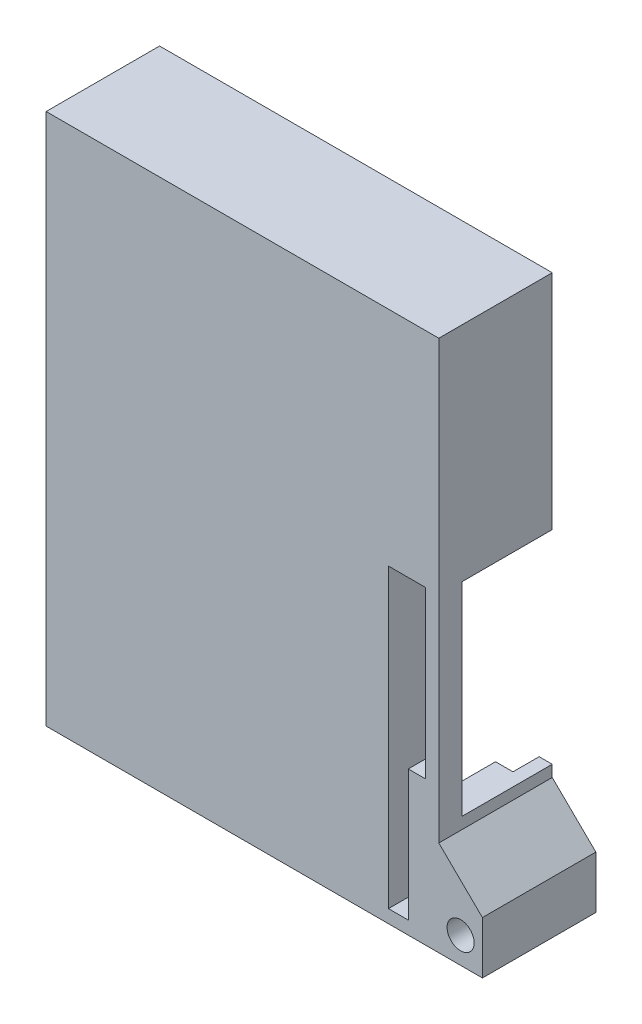
ISO-10303-21;
HEADER;
FILE_DESCRIPTION(('STEP AP214'),'2;1');
FILE_NAME('part.step','',(''),(''),'','','');
FILE_SCHEMA(('AUTOMOTIVE_DESIGN { 1 0 10303 214 1 1 1 1 }'));
ENDSEC;
DATA;
#1=APPLICATION_CONTEXT('core data for automotive mechanical design processes');
#2=APPLICATION_PROTOCOL_DEFINITION('international standard','automotive_design',2000,#1);
#3=PRODUCT_CONTEXT('',#1,'mechanical');
#4=PRODUCT('Part','Part','',(#3));
#5=PRODUCT_RELATED_PRODUCT_CATEGORY('part','',(#4));
#6=PRODUCT_DEFINITION_FORMATION('','',#4);
#7=PRODUCT_DEFINITION_CONTEXT('part definition',#1,'design');
#8=PRODUCT_DEFINITION('design','',#6,#7);
#9=PRODUCT_DEFINITION_SHAPE('','',#8);
#10=(LENGTH_UNIT() NAMED_UNIT(*) SI_UNIT(.MILLI.,.METRE.));
#11=(NAMED_UNIT(*) PLANE_ANGLE_UNIT() SI_UNIT($,.RADIAN.));
#12=(NAMED_UNIT(*) SI_UNIT($,.STERADIAN.) SOLID_ANGLE_UNIT());
#13=UNCERTAINTY_MEASURE_WITH_UNIT(LENGTH_MEASURE(1.E-05),#10,'distance_accuracy_value','');
#14=(GEOMETRIC_REPRESENTATION_CONTEXT(3) GLOBAL_UNCERTAINTY_ASSIGNED_CONTEXT((#13)) GLOBAL_UNIT_ASSIGNED_CONTEXT((#10,
#11,#12)) REPRESENTATION_CONTEXT('',''));
#15=CARTESIAN_POINT('',(0.,0.,0.));
#16=DIRECTION('',(0.,0.,1.));
#17=DIRECTION('',(1.,0.,0.));
#18=AXIS2_PLACEMENT_3D('',#15,#16,#17);
#19=CARTESIAN_POINT('',(21.,0.,-13.));
#20=DIRECTION('',(1.,0.,0.));
#21=DIRECTION('',(0.,0.,-1.));
#22=AXIS2_PLACEMENT_3D('',#19,#20,#21);
#23=PLANE('',#22);
#24=DIRECTION('',(0.,1.,0.));
#25=VECTOR('',#24,1.);
#26=CARTESIAN_POINT('',(21.,0.,-13.));
#27=LINE('',#26,#25);
#28=CARTESIAN_POINT('',(21.,5.,-13.));
#29=VERTEX_POINT('',#28);
#30=CARTESIAN_POINT('',(21.,29.,-13.));
#31=VERTEX_POINT('',#30);
#32=EDGE_CURVE('E437',#29,#31,#27,.T.);
#33=ORIENTED_EDGE('',*,*,#32,.F.);
#34=DIRECTION('',(0.,0.,1.));
#35=VECTOR('',#34,1.);
#36=CARTESIAN_POINT('',(21.,5.,-13.));
#37=LINE('',#36,#35);
#38=CARTESIAN_POINT('',(21.,5.,-10.));
#39=VERTEX_POINT('',#38);
#40=EDGE_CURVE('E469',#29,#39,#37,.T.);
#41=ORIENTED_EDGE('',*,*,#40,.T.);
#42=DIRECTION('',(0.,1.,0.));
#43=VECTOR('',#42,1.);
#44=CARTESIAN_POINT('',(21.,0.,-10.));
#45=LINE('',#44,#43);
#46=CARTESIAN_POINT('',(21.,6.00000000000001,-10.));
#47=VERTEX_POINT('',#46);
#48=EDGE_CURVE('E363',#39,#47,#45,.T.);
#49=ORIENTED_EDGE('',*,*,#48,.T.);
#50=DIRECTION('',(0.,0.,1.));
#51=VECTOR('',#50,1.);
#52=CARTESIAN_POINT('',(21.,6.00000000000001,-10.));
#53=LINE('',#52,#51);
#54=CARTESIAN_POINT('',(21.,6.00000000000001,-6.5));
#55=VERTEX_POINT('',#54);
#56=EDGE_CURVE('E390',#47,#55,#53,.T.);
#57=ORIENTED_EDGE('',*,*,#56,.T.);
#58=DIRECTION('',(0.,1.,0.));
#59=VECTOR('',#58,1.);
#60=CARTESIAN_POINT('',(21.,0.,-6.5));
#61=LINE('',#60,#59);
#62=CARTESIAN_POINT('',(21.,29.,-6.5));
#63=VERTEX_POINT('',#62);
#64=EDGE_CURVE('E404',#55,#63,#61,.T.);
#65=ORIENTED_EDGE('',*,*,#64,.T.);
#66=DIRECTION('',(0.,0.,1.));
#67=VECTOR('',#66,1.);
#68=CARTESIAN_POINT('',(21.,29.,-13.));
#69=LINE('',#68,#67);
#70=EDGE_CURVE('E318',#31,#63,#69,.T.);
#71=ORIENTED_EDGE('',*,*,#70,.F.);
#72=EDGE_LOOP('',(#33,#41,#49,#57,#65,#71));
#73=FACE_BOUND('',#72,.T.);
#74=ADVANCED_FACE('F35',(#73),#23,.F.);
#75=DIRECTION('',(0.,0.,1.));
#76=VECTOR('',#75,1.);
#77=CARTESIAN_POINT('',(21.,5.,-10.));
#78=LINE('',#77,#76);
#79=CARTESIAN_POINT('',(21.,5.,-2.64239015168766));
#80=VERTEX_POINT('',#79);
#81=CARTESIAN_POINT('',(21.,5.,0.));
#82=VERTEX_POINT('',#81);
#83=EDGE_CURVE('E393',#80,#82,#78,.T.);
#84=ORIENTED_EDGE('',*,*,#83,.F.);
#85=DIRECTION('',(0.,-1.,0.));
#86=VECTOR('',#85,1.);
#87=CARTESIAN_POINT('',(21.,0.,-2.64239015168766));
#88=LINE('',#87,#86);
#89=CARTESIAN_POINT('',(21.,-14.,-2.64239015168766));
#90=VERTEX_POINT('',#89);
#91=EDGE_CURVE('E473',#80,#90,#88,.T.);
#92=ORIENTED_EDGE('',*,*,#91,.T.);
#93=DIRECTION('',(0.,0.,1.));
#94=VECTOR('',#93,1.);
#95=CARTESIAN_POINT('',(21.,-14.,-10.));
#96=LINE('',#95,#94);
#97=CARTESIAN_POINT('',(21.,-14.,0.));
#98=VERTEX_POINT('',#97);
#99=EDGE_CURVE('E350',#90,#98,#96,.T.);
#100=ORIENTED_EDGE('',*,*,#99,.T.);
#101=DIRECTION('',(0.,1.,0.));
#102=VECTOR('',#101,1.);
#103=CARTESIAN_POINT('',(21.,0.,0.));
#104=LINE('',#103,#102);
#105=EDGE_CURVE('E277',#98,#82,#104,.T.);
#106=ORIENTED_EDGE('',*,*,#105,.T.);
#107=EDGE_LOOP('',(#84,#92,#100,#106));
#108=FACE_BOUND('',#107,.T.);
#109=ADVANCED_FACE('F523',(#108),#23,.F.);
#110=CARTESIAN_POINT('',(0.,-29.,-13.));
#111=DIRECTION('',(0.,1.,0.));
#112=DIRECTION('',(-1.,0.,0.));
#113=AXIS2_PLACEMENT_3D('',#110,#111,#112);
#114=PLANE('',#113);
#115=DIRECTION('',(-1.,0.,0.));
#116=VECTOR('',#115,1.);
#117=CARTESIAN_POINT('',(0.,-29.,-8.));
#118=LINE('',#117,#116);
#119=CARTESIAN_POINT('',(16.7304094179877,-29.,-8.));
#120=VERTEX_POINT('',#119);
#121=CARTESIAN_POINT('',(15.2304094179877,-29.,-8.));
#122=VERTEX_POINT('',#121);
#123=EDGE_CURVE('E58',#120,#122,#118,.T.);
#124=ORIENTED_EDGE('',*,*,#123,.F.);
#125=DIRECTION('',(0.,0.,1.));
#126=VECTOR('',#125,1.);
#127=CARTESIAN_POINT('',(16.7304094179877,-29.,-8.));
#128=LINE('',#127,#126);
#129=CARTESIAN_POINT('',(16.7304094179877,-29.,0.));
#130=VERTEX_POINT('',#129);
#131=EDGE_CURVE('E348',#120,#130,#128,.T.);
#132=ORIENTED_EDGE('',*,*,#131,.T.);
#133=DIRECTION('',(-1.,0.,0.));
#134=VECTOR('',#133,1.);
#135=CARTESIAN_POINT('',(0.,-29.,0.));
#136=LINE('',#135,#134);
#137=CARTESIAN_POINT('',(19.,-29.,0.));
#138=VERTEX_POINT('',#137);
#139=EDGE_CURVE('E274',#138,#130,#136,.T.);
#140=ORIENTED_EDGE('',*,*,#139,.F.);
#141=DIRECTION('',(0.,0.,1.));
#142=VECTOR('',#141,1.);
#143=CARTESIAN_POINT('',(19.,-29.,-10.));
#144=LINE('',#143,#142);
#145=CARTESIAN_POINT('',(19.,-29.,-10.));
#146=VERTEX_POINT('',#145);
#147=EDGE_CURVE('E339',#146,#138,#144,.T.);
#148=ORIENTED_EDGE('',*,*,#147,.F.);
#149=DIRECTION('',(-1.,0.,0.));
#150=VECTOR('',#149,1.);
#151=CARTESIAN_POINT('',(0.,-29.,-10.));
#152=LINE('',#151,#150);
#153=CARTESIAN_POINT('',(21.,-29.,-10.));
#154=VERTEX_POINT('',#153);
#155=EDGE_CURVE('E337',#154,#146,#152,.T.);
#156=ORIENTED_EDGE('',*,*,#155,.F.);
#157=DIRECTION('',(0.,0.,1.));
#158=VECTOR('',#157,1.);
#159=CARTESIAN_POINT('',(21.,-29.,-13.));
#160=LINE('',#159,#158);
#161=CARTESIAN_POINT('',(21.,-29.,-13.));
#162=VERTEX_POINT('',#161);
#163=EDGE_CURVE('E315',#162,#154,#160,.T.);
#164=ORIENTED_EDGE('',*,*,#163,.F.);
#165=DIRECTION('',(-1.,0.,0.));
#166=VECTOR('',#165,1.);
#167=CARTESIAN_POINT('',(0.,-29.,-13.));
#168=LINE('',#167,#166);
#169=CARTESIAN_POINT('',(-21.,-29.,-13.));
#170=VERTEX_POINT('',#169);
#171=EDGE_CURVE('E302',#162,#170,#168,.T.);
#172=ORIENTED_EDGE('',*,*,#171,.T.);
#173=DIRECTION('',(0.,0.,1.));
#174=VECTOR('',#173,1.);
#175=CARTESIAN_POINT('',(-21.,-29.,-13.));
#176=LINE('',#175,#174);
#177=CARTESIAN_POINT('',(-21.,-29.,-1.));
#178=VERTEX_POINT('',#177);
#179=EDGE_CURVE('E273',#170,#178,#176,.T.);
#180=ORIENTED_EDGE('',*,*,#179,.T.);
#181=DIRECTION('',(-1.,0.,0.));
#182=VECTOR('',#181,1.);
#183=CARTESIAN_POINT('',(0.,-29.,-1.));
#184=LINE('',#183,#182);
#185=CARTESIAN_POINT('',(4.23040941798773,-29.,-0.999999999999999));
#186=VERTEX_POINT('',#185);
#187=EDGE_CURVE('E278',#186,#178,#184,.T.);
#188=ORIENTED_EDGE('',*,*,#187,.F.);
#189=DIRECTION('',(0.,0.,1.));
#190=VECTOR('',#189,1.);
#191=CARTESIAN_POINT('',(4.23040941798773,-29.,-4.5));
#192=LINE('',#191,#190);
#193=CARTESIAN_POINT('',(4.23040941798773,-29.,-4.5));
#194=VERTEX_POINT('',#193);
#195=EDGE_CURVE('E418',#194,#186,#192,.T.);
#196=ORIENTED_EDGE('',*,*,#195,.F.);
#197=DIRECTION('',(-1.,0.,0.));
#198=VECTOR('',#197,1.);
#199=CARTESIAN_POINT('',(0.,-29.,-4.5));
#200=LINE('',#199,#198);
#201=CARTESIAN_POINT('',(15.2304094179877,-29.,-4.5));
#202=VERTEX_POINT('',#201);
#203=EDGE_CURVE('E414',#202,#194,#200,.T.);
#204=ORIENTED_EDGE('',*,*,#203,.F.);
#205=DIRECTION('',(0.,0.,1.));
#206=VECTOR('',#205,1.);
#207=CARTESIAN_POINT('',(15.2304094179877,-29.,-8.));
#208=LINE('',#207,#206);
#209=EDGE_CURVE('E486',#122,#202,#208,.T.);
#210=ORIENTED_EDGE('',*,*,#209,.F.);
#211=EDGE_LOOP('',(#124,#132,#140,#148,#156,#164,#172,#180,#188,#196,#204,#210));
#212=FACE_BOUND('',#211,.T.);
#213=ADVANCED_FACE('F37',(#212),#114,.T.);
#214=DIRECTION('',(0.,1.,0.));
#215=VECTOR('',#214,1.);
#216=CARTESIAN_POINT('',(21.,0.,-10.));
#217=LINE('',#216,#215);
#218=CARTESIAN_POINT('',(21.,-18.2844266037705,-10.));
#219=VERTEX_POINT('',#218);
#220=EDGE_CURVE('E330',#154,#219,#217,.T.);
#221=ORIENTED_EDGE('',*,*,#220,.T.);
#222=DIRECTION('',(0.,0.,-1.));
#223=VECTOR('',#222,1.);
#224=CARTESIAN_POINT('',(21.,-18.2844266037705,-13.));
#225=LINE('',#224,#223);
#226=CARTESIAN_POINT('',(21.,-18.2844266037705,-13.));
#227=VERTEX_POINT('',#226);
#228=EDGE_CURVE('E50',#219,#227,#225,.T.);
#229=ORIENTED_EDGE('',*,*,#228,.T.);
#230=EDGE_CURVE('E253',#162,#227,#27,.T.);
#231=ORIENTED_EDGE('',*,*,#230,.F.);
#232=ORIENTED_EDGE('',*,*,#163,.T.);
#233=EDGE_LOOP('',(#221,#229,#231,#232));
#234=FACE_BOUND('',#233,.T.);
#235=ADVANCED_FACE('F335',(#234),#23,.F.);
#236=CARTESIAN_POINT('',(0.,29.,-13.));
#237=DIRECTION('',(0.,1.,0.));
#238=DIRECTION('',(-1.,0.,0.));
#239=AXIS2_PLACEMENT_3D('',#236,#237,#238);
#240=PLANE('',#239);
#241=DIRECTION('',(-1.,0.,0.));
#242=VECTOR('',#241,1.);
#243=CARTESIAN_POINT('',(0.,29.,-10.));
#244=LINE('',#243,#242);
#245=CARTESIAN_POINT('',(6.69289814976103,29.,-10.));
#246=VERTEX_POINT('',#245);
#247=CARTESIAN_POINT('',(4.23040941798773,29.,-10.));
#248=VERTEX_POINT('',#247);
#249=EDGE_CURVE('E370',#246,#248,#244,.T.);
#250=ORIENTED_EDGE('',*,*,#249,.T.);
#251=DIRECTION('',(0.,0.,1.));
#252=VECTOR('',#251,1.);
#253=CARTESIAN_POINT('',(4.23040941798773,29.,-10.));
#254=LINE('',#253,#252);
#255=CARTESIAN_POINT('',(4.23040941798773,29.,-0.999999999999999));
#256=VERTEX_POINT('',#255);
#257=EDGE_CURVE('E382',#248,#256,#254,.T.);
#258=ORIENTED_EDGE('',*,*,#257,.T.);
#259=DIRECTION('',(-1.,0.,0.));
#260=VECTOR('',#259,1.);
#261=CARTESIAN_POINT('',(0.,29.,-1.));
#262=LINE('',#261,#260);
#263=CARTESIAN_POINT('',(-21.,29.,-1.));
#264=VERTEX_POINT('',#263);
#265=EDGE_CURVE('E423',#256,#264,#262,.T.);
#266=ORIENTED_EDGE('',*,*,#265,.T.);
#267=DIRECTION('',(0.,0.,1.));
#268=VECTOR('',#267,1.);
#269=CARTESIAN_POINT('',(-21.,29.,-13.));
#270=LINE('',#269,#268);
#271=CARTESIAN_POINT('',(-21.,29.,-13.));
#272=VERTEX_POINT('',#271);
#273=EDGE_CURVE('E321',#272,#264,#270,.T.);
#274=ORIENTED_EDGE('',*,*,#273,.F.);
#275=DIRECTION('',(-1.,0.,0.));
#276=VECTOR('',#275,1.);
#277=CARTESIAN_POINT('',(0.,29.,-13.));
#278=LINE('',#277,#276);
#279=EDGE_CURVE('E435',#31,#272,#278,.T.);
#280=ORIENTED_EDGE('',*,*,#279,.F.);
#281=ORIENTED_EDGE('',*,*,#70,.T.);
#282=DIRECTION('',(-1.,0.,0.));
#283=VECTOR('',#282,1.);
#284=CARTESIAN_POINT('',(0.,29.,-6.5));
#285=LINE('',#284,#283);
#286=CARTESIAN_POINT('',(6.69289814976103,29.,-6.5));
#287=VERTEX_POINT('',#286);
#288=EDGE_CURVE('E406',#63,#287,#285,.T.);
#289=ORIENTED_EDGE('',*,*,#288,.T.);
#290=DIRECTION('',(0.,0.,1.));
#291=VECTOR('',#290,1.);
#292=CARTESIAN_POINT('',(6.69289814976103,29.,-10.));
#293=LINE('',#292,#291);
#294=EDGE_CURVE('E384',#246,#287,#293,.T.);
#295=ORIENTED_EDGE('',*,*,#294,.F.);
#296=EDGE_LOOP('',(#250,#258,#266,#274,#280,#281,#289,#295));
#297=FACE_BOUND('',#296,.T.);
#298=ADVANCED_FACE('F541',(#297),#240,.F.);
#299=CARTESIAN_POINT('',(-21.,0.,-13.));
#300=DIRECTION('',(1.,0.,0.));
#301=DIRECTION('',(0.,0.,-1.));
#302=AXIS2_PLACEMENT_3D('',#299,#300,#301);
#303=PLANE('',#302);
#304=ORIENTED_EDGE('',*,*,#273,.T.);
#305=DIRECTION('',(0.,1.,0.));
#306=VECTOR('',#305,1.);
#307=CARTESIAN_POINT('',(-21.,0.,-1.));
#308=LINE('',#307,#306);
#309=EDGE_CURVE('E425',#178,#264,#308,.T.);
#310=ORIENTED_EDGE('',*,*,#309,.F.);
#311=ORIENTED_EDGE('',*,*,#179,.F.);
#312=DIRECTION('',(0.,1.,0.));
#313=VECTOR('',#312,1.);
#314=CARTESIAN_POINT('',(-21.,0.,-13.));
#315=LINE('',#314,#313);
#316=EDGE_CURVE('E432',#170,#272,#315,.T.);
#317=ORIENTED_EDGE('',*,*,#316,.T.);
#318=EDGE_LOOP('',(#304,#310,#311,#317));
#319=FACE_BOUND('',#318,.T.);
#320=ADVANCED_FACE('F544',(#319),#303,.T.);
#321=CARTESIAN_POINT('',(0.,-30.5,-13.));
#322=DIRECTION('',(0.,1.,0.));
#323=DIRECTION('',(-1.,0.,0.));
#324=AXIS2_PLACEMENT_3D('',#321,#322,#323);
#325=PLANE('',#324);
#326=DIRECTION('',(-1.,0.,0.));
#327=VECTOR('',#326,1.);
#328=CARTESIAN_POINT('',(0.,-30.5,0.));
#329=LINE('',#328,#327);
#330=CARTESIAN_POINT('',(27.5,-30.5,0.));
#331=VERTEX_POINT('',#330);
#332=CARTESIAN_POINT('',(-22.5,-30.5,0.));
#333=VERTEX_POINT('',#332);
#334=EDGE_CURVE('E281',#331,#333,#329,.T.);
#335=ORIENTED_EDGE('',*,*,#334,.T.);
#336=DIRECTION('',(0.,0.,1.));
#337=VECTOR('',#336,1.);
#338=CARTESIAN_POINT('',(-22.5,-30.5,-13.));
#339=LINE('',#338,#337);
#340=CARTESIAN_POINT('',(-22.5,-30.5,-13.));
#341=VERTEX_POINT('',#340);
#342=EDGE_CURVE('E303',#341,#333,#339,.T.);
#343=ORIENTED_EDGE('',*,*,#342,.F.);
#344=DIRECTION('',(-1.,0.,0.));
#345=VECTOR('',#344,1.);
#346=CARTESIAN_POINT('',(0.,-30.5,-13.));
#347=LINE('',#346,#345);
#348=CARTESIAN_POINT('',(27.5,-30.5,-13.));
#349=VERTEX_POINT('',#348);
#350=EDGE_CURVE('E439',#349,#341,#347,.T.);
#351=ORIENTED_EDGE('',*,*,#350,.F.);
#352=DIRECTION('',(0.,0.,1.));
#353=VECTOR('',#352,1.);
#354=CARTESIAN_POINT('',(27.5,-30.5,-13.));
#355=LINE('',#354,#353);
#356=EDGE_CURVE('E313',#349,#331,#355,.T.);
#357=ORIENTED_EDGE('',*,*,#356,.T.);
#358=EDGE_LOOP('',(#335,#343,#351,#357));
#359=FACE_BOUND('',#358,.T.);
#360=ADVANCED_FACE('F453',(#359),#325,.F.);
#361=CARTESIAN_POINT('',(-22.5,0.,-13.));
#362=DIRECTION('',(1.,0.,0.));
#363=DIRECTION('',(0.,0.,-1.));
#364=AXIS2_PLACEMENT_3D('',#361,#362,#363);
#365=PLANE('',#364);
#366=DIRECTION('',(0.,1.,0.));
#367=VECTOR('',#366,1.);
#368=CARTESIAN_POINT('',(-22.5,0.,0.));
#369=LINE('',#368,#367);
#370=CARTESIAN_POINT('',(-22.5,30.5,0.));
#371=VERTEX_POINT('',#370);
#372=EDGE_CURVE('E296',#333,#371,#369,.T.);
#373=ORIENTED_EDGE('',*,*,#372,.T.);
#374=DIRECTION('',(0.,0.,1.));
#375=VECTOR('',#374,1.);
#376=CARTESIAN_POINT('',(-22.5,30.5,-13.));
#377=LINE('',#376,#375);
#378=CARTESIAN_POINT('',(-22.5,30.5,-13.));
#379=VERTEX_POINT('',#378);
#380=EDGE_CURVE('E306',#379,#371,#377,.T.);
#381=ORIENTED_EDGE('',*,*,#380,.F.);
#382=DIRECTION('',(0.,1.,0.));
#383=VECTOR('',#382,1.);
#384=CARTESIAN_POINT('',(-22.5,0.,-13.));
#385=LINE('',#384,#383);
#386=EDGE_CURVE('E263',#341,#379,#385,.T.);
#387=ORIENTED_EDGE('',*,*,#386,.F.);
#388=ORIENTED_EDGE('',*,*,#342,.T.);
#389=EDGE_LOOP('',(#373,#381,#387,#388));
#390=FACE_BOUND('',#389,.T.);
#391=ADVANCED_FACE('F456',(#390),#365,.F.);
#392=CARTESIAN_POINT('',(0.,30.5,-13.));
#393=DIRECTION('',(0.,1.,0.));
#394=DIRECTION('',(-1.,0.,0.));
#395=AXIS2_PLACEMENT_3D('',#392,#393,#394);
#396=PLANE('',#395);
#397=DIRECTION('',(-1.,0.,0.));
#398=VECTOR('',#397,1.);
#399=CARTESIAN_POINT('',(0.,30.5,0.));
#400=LINE('',#399,#398);
#401=CARTESIAN_POINT('',(22.5,30.5,0.));
#402=VERTEX_POINT('',#401);
#403=EDGE_CURVE('E293',#402,#371,#400,.T.);
#404=ORIENTED_EDGE('',*,*,#403,.F.);
#405=DIRECTION('',(0.,0.,1.));
#406=VECTOR('',#405,1.);
#407=CARTESIAN_POINT('',(22.5,30.5,-13.));
#408=LINE('',#407,#406);
#409=CARTESIAN_POINT('',(22.5,30.5,-13.));
#410=VERTEX_POINT('',#409);
#411=EDGE_CURVE('E308',#410,#402,#408,.T.);
#412=ORIENTED_EDGE('',*,*,#411,.F.);
#413=DIRECTION('',(-1.,0.,0.));
#414=VECTOR('',#413,1.);
#415=CARTESIAN_POINT('',(0.,30.5,-13.));
#416=LINE('',#415,#414);
#417=EDGE_CURVE('E259',#410,#379,#416,.T.);
#418=ORIENTED_EDGE('',*,*,#417,.T.);
#419=ORIENTED_EDGE('',*,*,#380,.T.);
#420=EDGE_LOOP('',(#404,#412,#418,#419));
#421=FACE_BOUND('',#420,.T.);
#422=ADVANCED_FACE('F460',(#421),#396,.T.);
#423=CARTESIAN_POINT('',(22.5,0.,-13.));
#424=DIRECTION('',(1.,0.,0.));
#425=DIRECTION('',(0.,0.,-1.));
#426=AXIS2_PLACEMENT_3D('',#423,#424,#425);
#427=PLANE('',#426);
#428=DIRECTION('',(0.,0.,1.));
#429=VECTOR('',#428,1.);
#430=CARTESIAN_POINT('',(22.5,5.,-13.));
#431=LINE('',#430,#429);
#432=CARTESIAN_POINT('',(22.5,5.,-13.));
#433=VERTEX_POINT('',#432);
#434=CARTESIAN_POINT('',(22.5,5.,-2.64239015168766));
#435=VERTEX_POINT('',#434);
#436=EDGE_CURVE('E464',#433,#435,#431,.T.);
#437=ORIENTED_EDGE('',*,*,#436,.F.);
#438=DIRECTION('',(0.,1.,0.));
#439=VECTOR('',#438,1.);
#440=CARTESIAN_POINT('',(22.5,0.,-13.));
#441=LINE('',#440,#439);
#442=EDGE_CURVE('E260',#433,#410,#441,.T.);
#443=ORIENTED_EDGE('',*,*,#442,.T.);
#444=ORIENTED_EDGE('',*,*,#411,.T.);
#445=DIRECTION('',(0.,1.,0.));
#446=VECTOR('',#445,1.);
#447=CARTESIAN_POINT('',(22.5,0.,0.));
#448=LINE('',#447,#446);
#449=CARTESIAN_POINT('',(22.5,-19.6010205144336,0.));
#450=VERTEX_POINT('',#449);
#451=EDGE_CURVE('E290',#450,#402,#448,.T.);
#452=ORIENTED_EDGE('',*,*,#451,.F.);
#453=DIRECTION('',(0.,0.,1.));
#454=VECTOR('',#453,1.);
#455=CARTESIAN_POINT('',(22.5,-19.6010205144336,-13.));
#456=LINE('',#455,#454);
#457=CARTESIAN_POINT('',(22.5,-19.6010205144336,-13.));
#458=VERTEX_POINT('',#457);
#459=EDGE_CURVE('E258',#458,#450,#456,.T.);
#460=ORIENTED_EDGE('',*,*,#459,.F.);
#461=CARTESIAN_POINT('',(22.5,-18.2844266037705,-13.));
#462=VERTEX_POINT('',#461);
#463=EDGE_CURVE('E249',#458,#462,#441,.T.);
#464=ORIENTED_EDGE('',*,*,#463,.T.);
#465=DIRECTION('',(0.,0.,-1.));
#466=VECTOR('',#465,1.);
#467=CARTESIAN_POINT('',(22.5,-18.2844266037705,-13.));
#468=LINE('',#467,#466);
#469=CARTESIAN_POINT('',(22.5,-18.2844266037705,-2.64239015168766));
#470=VERTEX_POINT('',#469);
#471=EDGE_CURVE('E231',#470,#462,#468,.T.);
#472=ORIENTED_EDGE('',*,*,#471,.F.);
#473=DIRECTION('',(0.,-1.,0.));
#474=VECTOR('',#473,1.);
#475=CARTESIAN_POINT('',(22.5,0.,-2.64239015168766));
#476=LINE('',#475,#474);
#477=EDGE_CURVE('E465',#435,#470,#476,.T.);
#478=ORIENTED_EDGE('',*,*,#477,.F.);
#479=EDGE_LOOP('',(#437,#443,#444,#452,#460,#464,#472,#478));
#480=FACE_BOUND('',#479,.T.);
#481=ADVANCED_FACE('F256',(#480),#427,.T.);
#482=CARTESIAN_POINT('',(1.22193904118615,1.24713631153825,-13.));
#483=DIRECTION('',(0.699854212223765,0.714285714285714,0.));
#484=DIRECTION('',(-0.714285714285714,0.699854212223765,0.));
#485=AXIS2_PLACEMENT_3D('',#482,#483,#484);
#486=PLANE('',#485);
#487=DIRECTION('',(-0.714285714285714,0.699854212223765,0.));
#488=VECTOR('',#487,1.);
#489=CARTESIAN_POINT('',(1.22193904118615,1.24713631153825,0.));
#490=LINE('',#489,#488);
#491=CARTESIAN_POINT('',(27.5,-24.5,0.));
#492=VERTEX_POINT('',#491);
#493=EDGE_CURVE('E287',#492,#450,#490,.T.);
#494=ORIENTED_EDGE('',*,*,#493,.F.);
#495=DIRECTION('',(0.,0.,1.));
#496=VECTOR('',#495,1.);
#497=CARTESIAN_POINT('',(27.5,-24.5,-13.));
#498=LINE('',#497,#496);
#499=CARTESIAN_POINT('',(27.5,-24.5,-13.));
#500=VERTEX_POINT('',#499);
#501=EDGE_CURVE('E311',#500,#492,#498,.T.);
#502=ORIENTED_EDGE('',*,*,#501,.F.);
#503=DIRECTION('',(-0.714285714285714,0.699854212223765,0.));
#504=VECTOR('',#503,1.);
#505=CARTESIAN_POINT('',(1.22193904118615,1.24713631153825,-13.));
#506=LINE('',#505,#504);
#507=EDGE_CURVE('E265',#500,#458,#506,.T.);
#508=ORIENTED_EDGE('',*,*,#507,.T.);
#509=ORIENTED_EDGE('',*,*,#459,.T.);
#510=EDGE_LOOP('',(#494,#502,#508,#509));
#511=FACE_BOUND('',#510,.T.);
#512=ADVANCED_FACE('F447',(#511),#486,.T.);
#513=CARTESIAN_POINT('',(27.5,0.,-13.));
#514=DIRECTION('',(1.,0.,0.));
#515=DIRECTION('',(0.,0.,-1.));
#516=AXIS2_PLACEMENT_3D('',#513,#514,#515);
#517=PLANE('',#516);
#518=DIRECTION('',(0.,1.,0.));
#519=VECTOR('',#518,1.);
#520=CARTESIAN_POINT('',(27.5,0.,0.));
#521=LINE('',#520,#519);
#522=EDGE_CURVE('E284',#331,#492,#521,.T.);
#523=ORIENTED_EDGE('',*,*,#522,.F.);
#524=ORIENTED_EDGE('',*,*,#356,.F.);
#525=DIRECTION('',(0.,1.,0.));
#526=VECTOR('',#525,1.);
#527=CARTESIAN_POINT('',(27.5,0.,-13.));
#528=LINE('',#527,#526);
#529=EDGE_CURVE('E441',#349,#500,#528,.T.);
#530=ORIENTED_EDGE('',*,*,#529,.T.);
#531=ORIENTED_EDGE('',*,*,#501,.T.);
#532=EDGE_LOOP('',(#523,#524,#530,#531));
#533=FACE_BOUND('',#532,.T.);
#534=ADVANCED_FACE('F821',(#533),#517,.T.);
#535=CARTESIAN_POINT('',(25.,-27.5,-13.));
#536=DIRECTION('',(0.,0.,1.));
#537=DIRECTION('',(1.,0.,0.));
#538=AXIS2_PLACEMENT_3D('',#535,#536,#537);
#539=CYLINDRICAL_SURFACE('',#538,1.55);
#540=CARTESIAN_POINT('',(25.,-27.5,-13.));
#541=DIRECTION('',(0.,0.,1.));
#542=DIRECTION('',(1.,0.,0.));
#543=AXIS2_PLACEMENT_3D('',#540,#541,#542);
#544=CIRCLE('',#543,1.55);
#545=CARTESIAN_POINT('',(26.55,-27.5,-13.));
#546=VERTEX_POINT('',#545);
#547=EDGE_CURVE('E270',#546,#546,#544,.T.);
#548=CARTESIAN_POINT('',(25.,-27.5,0.));
#549=DIRECTION('',(0.,0.,1.));
#550=DIRECTION('',(1.,0.,0.));
#551=AXIS2_PLACEMENT_3D('',#548,#549,#550);
#552=CIRCLE('',#551,1.55);
#553=CARTESIAN_POINT('',(26.55,-27.5,0.));
#554=VERTEX_POINT('',#553);
#555=EDGE_CURVE('E299',#554,#554,#552,.T.);
#556=CARTESIAN_POINT('',(26.55,-27.5,-13.));
#557=CARTESIAN_POINT('',(26.55,-27.5,-12.8645833333333));
#558=CARTESIAN_POINT('',(26.55,-27.5,-12.7291666666667));
#559=CARTESIAN_POINT('',(26.55,-27.5,-12.4583333333333));
#560=CARTESIAN_POINT('',(26.55,-27.5,-12.3229166666667));
#561=CARTESIAN_POINT('',(26.55,-27.5,-12.0520833333333));
#562=CARTESIAN_POINT('',(26.55,-27.5,-11.9166666666667));
#563=CARTESIAN_POINT('',(26.55,-27.5,-11.6458333333333));
#564=CARTESIAN_POINT('',(26.55,-27.5,-11.5104166666667));
#565=CARTESIAN_POINT('',(26.55,-27.5,-11.2395833333333));
#566=CARTESIAN_POINT('',(26.55,-27.5,-11.1041666666667));
#567=CARTESIAN_POINT('',(26.55,-27.5,-10.8333333333333));
#568=CARTESIAN_POINT('',(26.55,-27.5,-10.6979166666667));
#569=CARTESIAN_POINT('',(26.55,-27.5,-10.4270833333333));
#570=CARTESIAN_POINT('',(26.55,-27.5,-10.2916666666667));
#571=CARTESIAN_POINT('',(26.55,-27.5,-10.0208333333333));
#572=CARTESIAN_POINT('',(26.55,-27.5,-9.88541666666667));
#573=CARTESIAN_POINT('',(26.55,-27.5,-9.61458333333333));
#574=CARTESIAN_POINT('',(26.55,-27.5,-9.47916666666667));
#575=CARTESIAN_POINT('',(26.55,-27.5,-9.20833333333333));
#576=CARTESIAN_POINT('',(26.55,-27.5,-9.07291666666667));
#577=CARTESIAN_POINT('',(26.55,-27.5,-8.80208333333333));
#578=CARTESIAN_POINT('',(26.55,-27.5,-8.66666666666667));
#579=CARTESIAN_POINT('',(26.55,-27.5,-8.39583333333333));
#580=CARTESIAN_POINT('',(26.55,-27.5,-8.26041666666667));
#581=CARTESIAN_POINT('',(26.55,-27.5,-7.98958333333333));
#582=CARTESIAN_POINT('',(26.55,-27.5,-7.85416666666667));
#583=CARTESIAN_POINT('',(26.55,-27.5,-7.58333333333333));
#584=CARTESIAN_POINT('',(26.55,-27.5,-7.44791666666667));
#585=CARTESIAN_POINT('',(26.55,-27.5,-7.17708333333333));
#586=CARTESIAN_POINT('',(26.55,-27.5,-7.04166666666667));
#587=CARTESIAN_POINT('',(26.55,-27.5,-6.77083333333333));
#588=CARTESIAN_POINT('',(26.55,-27.5,-6.63541666666667));
#589=CARTESIAN_POINT('',(26.55,-27.5,-6.36458333333333));
#590=CARTESIAN_POINT('',(26.55,-27.5,-6.22916666666667));
#591=CARTESIAN_POINT('',(26.55,-27.5,-5.95833333333333));
#592=CARTESIAN_POINT('',(26.55,-27.5,-5.82291666666667));
#593=CARTESIAN_POINT('',(26.55,-27.5,-5.55208333333333));
#594=CARTESIAN_POINT('',(26.55,-27.5,-5.41666666666667));
#595=CARTESIAN_POINT('',(26.55,-27.5,-5.14583333333333));
#596=CARTESIAN_POINT('',(26.55,-27.5,-5.01041666666667));
#597=CARTESIAN_POINT('',(26.55,-27.5,-4.73958333333333));
#598=CARTESIAN_POINT('',(26.55,-27.5,-4.60416666666667));
#599=CARTESIAN_POINT('',(26.55,-27.5,-4.33333333333333));
#600=CARTESIAN_POINT('',(26.55,-27.5,-4.19791666666667));
#601=CARTESIAN_POINT('',(26.55,-27.5,-3.92708333333333));
#602=CARTESIAN_POINT('',(26.55,-27.5,-3.79166666666667));
#603=CARTESIAN_POINT('',(26.55,-27.5,-3.52083333333333));
#604=CARTESIAN_POINT('',(26.55,-27.5,-3.38541666666667));
#605=CARTESIAN_POINT('',(26.55,-27.5,-3.11458333333333));
#606=CARTESIAN_POINT('',(26.55,-27.5,-2.97916666666667));
#607=CARTESIAN_POINT('',(26.55,-27.5,-2.70833333333333));
#608=CARTESIAN_POINT('',(26.55,-27.5,-2.57291666666667));
#609=CARTESIAN_POINT('',(26.55,-27.5,-2.30208333333333));
#610=CARTESIAN_POINT('',(26.55,-27.5,-2.16666666666667));
#611=CARTESIAN_POINT('',(26.55,-27.5,-1.89583333333333));
#612=CARTESIAN_POINT('',(26.55,-27.5,-1.76041666666667));
#613=CARTESIAN_POINT('',(26.55,-27.5,-1.48958333333333));
#614=CARTESIAN_POINT('',(26.55,-27.5,-1.35416666666667));
#615=CARTESIAN_POINT('',(26.55,-27.5,-1.08333333333333));
#616=CARTESIAN_POINT('',(26.55,-27.5,-0.947916666666667));
#617=CARTESIAN_POINT('',(26.55,-27.5,-0.677083333333334));
#618=CARTESIAN_POINT('',(26.55,-27.5,-0.541666666666667));
#619=CARTESIAN_POINT('',(26.55,-27.5,-0.270833333333334));
#620=CARTESIAN_POINT('',(26.55,-27.5,-0.135416666666667));
#621=CARTESIAN_POINT('',(26.55,-27.5,0.));
#622=B_SPLINE_CURVE_WITH_KNOTS('',3,(#556,#557,#558,#559,#560,#561,#562,#563,#564,#565,#566,
#567,#568,#569,#570,#571,#572,#573,#574,#575,#576,#577,#578,#579,#580,#581,#582,#583,#584,#585,
#586,#587,#588,#589,#590,#591,#592,#593,#594,#595,#596,#597,#598,#599,#600,#601,#602,#603,#604,
#605,#606,#607,#608,#609,#610,#611,#612,#613,#614,#615,#616,#617,#618,#619,#620,#621),
.UNSPECIFIED.,.F.,.F.,(4,2,2,2,2,2,2,2,2,2,2,2,2,2,2,2,2,2,2,2,2,2,2,2,2,2,2,2,2,2,2,2,4),(0.,
0.406249999999999,0.812499999999999,1.21875,1.625,2.03125,2.4375,2.84375,3.25,3.65625,4.0625,
4.46875,4.875,5.28125,5.6875,6.09375,6.5,6.90625,7.3125,7.71875,8.125,8.53125,8.9375,9.34375,
9.75,10.15625,10.5625,10.96875,11.375,11.78125,12.1875,12.59375,13.),.UNSPECIFIED.);
#623=EDGE_CURVE('BSEAM638',#546,#554,#622,.T.);
#624=ORIENTED_EDGE('',*,*,#547,.F.);
#625=ORIENTED_EDGE('',*,*,#555,.T.);
#626=ORIENTED_EDGE('',*,*,#623,.T.);
#627=ORIENTED_EDGE('',*,*,#623,.F.);
#628=EDGE_LOOP('',(#624,#626,#625,#627));
#629=FACE_BOUND('',#628,.T.);
#630=ADVANCED_FACE('F638',(#629),#539,.F.);
#631=CARTESIAN_POINT('',(0.,0.,-13.));
#632=DIRECTION('',(0.,0.,1.));
#633=DIRECTION('',(1.,0.,0.));
#634=AXIS2_PLACEMENT_3D('',#631,#632,#633);
#635=PLANE('',#634);
#636=ORIENTED_EDGE('',*,*,#442,.F.);
#637=DIRECTION('',(-1.,0.,0.));
#638=VECTOR('',#637,1.);
#639=CARTESIAN_POINT('',(23.5,5.,-13.));
#640=LINE('',#639,#638);
#641=EDGE_CURVE('E462',#433,#29,#640,.T.);
#642=ORIENTED_EDGE('',*,*,#641,.T.);
#643=ORIENTED_EDGE('',*,*,#32,.T.);
#644=ORIENTED_EDGE('',*,*,#279,.T.);
#645=ORIENTED_EDGE('',*,*,#316,.F.);
#646=ORIENTED_EDGE('',*,*,#171,.F.);
#647=ORIENTED_EDGE('',*,*,#230,.T.);
#648=DIRECTION('',(-1.,0.,0.));
#649=VECTOR('',#648,1.);
#650=CARTESIAN_POINT('',(23.5,-18.2844266037705,-13.));
#651=LINE('',#650,#649);
#652=EDGE_CURVE('E234',#462,#227,#651,.T.);
#653=ORIENTED_EDGE('',*,*,#652,.F.);
#654=ORIENTED_EDGE('',*,*,#463,.F.);
#655=ORIENTED_EDGE('',*,*,#507,.F.);
#656=ORIENTED_EDGE('',*,*,#529,.F.);
#657=ORIENTED_EDGE('',*,*,#350,.T.);
#658=ORIENTED_EDGE('',*,*,#386,.T.);
#659=ORIENTED_EDGE('',*,*,#417,.F.);
#660=EDGE_LOOP('',(#636,#642,#643,#644,#645,#646,#647,#653,#654,#655,#656,#657,#658,#659));
#661=FACE_BOUND('',#660,.T.);
#662=ORIENTED_EDGE('',*,*,#547,.T.);
#663=EDGE_LOOP('',(#662));
#664=FACE_BOUND('',#663,.T.);
#665=ADVANCED_FACE('F246',(#661,#664),#635,.F.);
#666=CARTESIAN_POINT('',(0.,0.,0.));
#667=DIRECTION('',(0.,0.,1.));
#668=DIRECTION('',(1.,0.,0.));
#669=AXIS2_PLACEMENT_3D('',#666,#667,#668);
#670=PLANE('',#669);
#671=ORIENTED_EDGE('',*,*,#139,.T.);
#672=DIRECTION('',(0.,-1.,0.));
#673=VECTOR('',#672,1.);
#674=CARTESIAN_POINT('',(16.7304094179877,0.,0.));
#675=LINE('',#674,#673);
#676=CARTESIAN_POINT('',(16.7304094179877,5.,0.));
#677=VERTEX_POINT('',#676);
#678=EDGE_CURVE('E352',#677,#130,#675,.T.);
#679=ORIENTED_EDGE('',*,*,#678,.F.);
#680=DIRECTION('',(-1.,0.,0.));
#681=VECTOR('',#680,1.);
#682=CARTESIAN_POINT('',(0.,5.,0.));
#683=LINE('',#682,#681);
#684=EDGE_CURVE('E359',#82,#677,#683,.T.);
#685=ORIENTED_EDGE('',*,*,#684,.F.);
#686=ORIENTED_EDGE('',*,*,#105,.F.);
#687=DIRECTION('',(-1.,0.,0.));
#688=VECTOR('',#687,1.);
#689=CARTESIAN_POINT('',(0.,-14.,0.));
#690=LINE('',#689,#688);
#691=CARTESIAN_POINT('',(19.,-14.,0.));
#692=VERTEX_POINT('',#691);
#693=EDGE_CURVE('E344',#98,#692,#690,.T.);
#694=ORIENTED_EDGE('',*,*,#693,.T.);
#695=DIRECTION('',(0.,-1.,0.));
#696=VECTOR('',#695,1.);
#697=CARTESIAN_POINT('',(19.,0.,0.));
#698=LINE('',#697,#696);
#699=EDGE_CURVE('E347',#692,#138,#698,.T.);
#700=ORIENTED_EDGE('',*,*,#699,.T.);
#701=EDGE_LOOP('',(#671,#679,#685,#686,#694,#700));
#702=FACE_BOUND('',#701,.T.);
#703=ORIENTED_EDGE('',*,*,#334,.F.);
#704=ORIENTED_EDGE('',*,*,#522,.T.);
#705=ORIENTED_EDGE('',*,*,#493,.T.);
#706=ORIENTED_EDGE('',*,*,#451,.T.);
#707=ORIENTED_EDGE('',*,*,#403,.T.);
#708=ORIENTED_EDGE('',*,*,#372,.F.);
#709=EDGE_LOOP('',(#703,#704,#705,#706,#707,#708));
#710=FACE_BOUND('',#709,.T.);
#711=ORIENTED_EDGE('',*,*,#555,.F.);
#712=EDGE_LOOP('',(#711));
#713=FACE_BOUND('',#712,.T.);
#714=ADVANCED_FACE('F499',(#702,#710,#713),#670,.T.);
#715=CARTESIAN_POINT('',(0.,0.,-1.));
#716=DIRECTION('',(0.,0.,1.));
#717=DIRECTION('',(1.,0.,0.));
#718=AXIS2_PLACEMENT_3D('',#715,#716,#717);
#719=PLANE('',#718);
#720=DIRECTION('',(0.,-1.,0.));
#721=VECTOR('',#720,1.);
#722=CARTESIAN_POINT('',(4.23040941798773,0.,-1.));
#723=LINE('',#722,#721);
#724=EDGE_CURVE('E421',#256,#186,#723,.T.);
#725=ORIENTED_EDGE('',*,*,#724,.T.);
#726=ORIENTED_EDGE('',*,*,#187,.T.);
#727=ORIENTED_EDGE('',*,*,#309,.T.);
#728=ORIENTED_EDGE('',*,*,#265,.F.);
#729=EDGE_LOOP('',(#725,#726,#727,#728));
#730=FACE_BOUND('',#729,.T.);
#731=ADVANCED_FACE('F548',(#730),#719,.F.);
#732=CARTESIAN_POINT('',(4.23040941798773,0.,-4.5));
#733=DIRECTION('',(-1.,0.,0.));
#734=DIRECTION('',(0.,-1.,0.));
#735=AXIS2_PLACEMENT_3D('',#732,#733,#734);
#736=PLANE('',#735);
#737=ORIENTED_EDGE('',*,*,#195,.T.);
#738=ORIENTED_EDGE('',*,*,#724,.F.);
#739=ORIENTED_EDGE('',*,*,#257,.F.);
#740=DIRECTION('',(0.,-1.,0.));
#741=VECTOR('',#740,1.);
#742=CARTESIAN_POINT('',(4.23040941798773,0.,-10.));
#743=LINE('',#742,#741);
#744=CARTESIAN_POINT('',(4.23040941798773,4.,-10.));
#745=VERTEX_POINT('',#744);
#746=EDGE_CURVE('E372',#248,#745,#743,.T.);
#747=ORIENTED_EDGE('',*,*,#746,.T.);
#748=DIRECTION('',(0.,0.,1.));
#749=VECTOR('',#748,1.);
#750=CARTESIAN_POINT('',(4.23040941798773,4.,-10.));
#751=LINE('',#750,#749);
#752=CARTESIAN_POINT('',(4.23040941798773,4.,-4.5));
#753=VERTEX_POINT('',#752);
#754=EDGE_CURVE('E378',#745,#753,#751,.T.);
#755=ORIENTED_EDGE('',*,*,#754,.T.);
#756=DIRECTION('',(0.,-1.,0.));
#757=VECTOR('',#756,1.);
#758=CARTESIAN_POINT('',(4.23040941798773,0.,-4.5));
#759=LINE('',#758,#757);
#760=EDGE_CURVE('E411',#753,#194,#759,.T.);
#761=ORIENTED_EDGE('',*,*,#760,.T.);
#762=EDGE_LOOP('',(#737,#738,#739,#747,#755,#761));
#763=FACE_BOUND('',#762,.T.);
#764=ADVANCED_FACE('F552',(#763),#736,.T.);
#765=CARTESIAN_POINT('',(0.,0.,-4.5));
#766=DIRECTION('',(0.,0.,1.));
#767=DIRECTION('',(1.,0.,0.));
#768=AXIS2_PLACEMENT_3D('',#765,#766,#767);
#769=PLANE('',#768);
#770=DIRECTION('',(1.,0.,0.));
#771=VECTOR('',#770,1.);
#772=CARTESIAN_POINT('',(0.,4.,-4.5));
#773=LINE('',#772,#771);
#774=CARTESIAN_POINT('',(15.2304094179877,4.,-4.5));
#775=VERTEX_POINT('',#774);
#776=EDGE_CURVE('E408',#753,#775,#773,.T.);
#777=ORIENTED_EDGE('',*,*,#776,.T.);
#778=DIRECTION('',(0.,-1.,0.));
#779=VECTOR('',#778,1.);
#780=CARTESIAN_POINT('',(15.2304094179877,0.,-4.5));
#781=LINE('',#780,#779);
#782=EDGE_CURVE('E416',#775,#202,#781,.T.);
#783=ORIENTED_EDGE('',*,*,#782,.T.);
#784=ORIENTED_EDGE('',*,*,#203,.T.);
#785=ORIENTED_EDGE('',*,*,#760,.F.);
#786=EDGE_LOOP('',(#777,#783,#784,#785));
#787=FACE_BOUND('',#786,.T.);
#788=ADVANCED_FACE('F579',(#787),#769,.F.);
#789=CARTESIAN_POINT('',(0.,0.,-6.5));
#790=DIRECTION('',(0.,0.,1.));
#791=DIRECTION('',(1.,0.,0.));
#792=AXIS2_PLACEMENT_3D('',#789,#790,#791);
#793=PLANE('',#792);
#794=DIRECTION('',(0.,-1.,0.));
#795=VECTOR('',#794,1.);
#796=CARTESIAN_POINT('',(6.69289814976103,0.,-6.5));
#797=LINE('',#796,#795);
#798=CARTESIAN_POINT('',(6.69289814976103,6.00000000000001,-6.5));
#799=VERTEX_POINT('',#798);
#800=EDGE_CURVE('E381',#287,#799,#797,.T.);
#801=ORIENTED_EDGE('',*,*,#800,.F.);
#802=ORIENTED_EDGE('',*,*,#288,.F.);
#803=ORIENTED_EDGE('',*,*,#64,.F.);
#804=DIRECTION('',(1.,0.,0.));
#805=VECTOR('',#804,1.);
#806=CARTESIAN_POINT('',(0.,6.00000000000001,-6.5));
#807=LINE('',#806,#805);
#808=EDGE_CURVE('E401',#799,#55,#807,.T.);
#809=ORIENTED_EDGE('',*,*,#808,.F.);
#810=EDGE_LOOP('',(#801,#802,#803,#809));
#811=FACE_BOUND('',#810,.T.);
#812=ADVANCED_FACE('F577',(#811),#793,.F.);
#813=CARTESIAN_POINT('',(0.,4.,-10.));
#814=DIRECTION('',(0.,-1.,0.));
#815=DIRECTION('',(0.,0.,-1.));
#816=AXIS2_PLACEMENT_3D('',#813,#814,#815);
#817=PLANE('',#816);
#818=DIRECTION('',(0.,0.,1.));
#819=VECTOR('',#818,1.);
#820=CARTESIAN_POINT('',(15.2304094179877,4.,-8.));
#821=LINE('',#820,#819);
#822=CARTESIAN_POINT('',(15.2304094179877,4.,-8.));
#823=VERTEX_POINT('',#822);
#824=EDGE_CURVE('E484',#823,#775,#821,.T.);
#825=ORIENTED_EDGE('',*,*,#824,.T.);
#826=ORIENTED_EDGE('',*,*,#776,.F.);
#827=ORIENTED_EDGE('',*,*,#754,.F.);
#828=DIRECTION('',(1.,0.,0.));
#829=VECTOR('',#828,1.);
#830=CARTESIAN_POINT('',(0.,4.,-10.));
#831=LINE('',#830,#829);
#832=CARTESIAN_POINT('',(16.7304094179877,4.,-10.));
#833=VERTEX_POINT('',#832);
#834=EDGE_CURVE('E355',#745,#833,#831,.T.);
#835=ORIENTED_EDGE('',*,*,#834,.T.);
#836=DIRECTION('',(0.,0.,1.));
#837=VECTOR('',#836,1.);
#838=CARTESIAN_POINT('',(16.7304094179877,4.,-10.));
#839=LINE('',#838,#837);
#840=CARTESIAN_POINT('',(16.7304094179877,4.,-8.));
#841=VERTEX_POINT('',#840);
#842=EDGE_CURVE('E375',#833,#841,#839,.T.);
#843=ORIENTED_EDGE('',*,*,#842,.T.);
#844=DIRECTION('',(1.,0.,0.));
#845=VECTOR('',#844,1.);
#846=CARTESIAN_POINT('',(0.,4.,-8.));
#847=LINE('',#846,#845);
#848=EDGE_CURVE('E471',#823,#841,#847,.T.);
#849=ORIENTED_EDGE('',*,*,#848,.F.);
#850=EDGE_LOOP('',(#825,#826,#827,#835,#843,#849));
#851=FACE_BOUND('',#850,.T.);
#852=ADVANCED_FACE('F563',(#851),#817,.T.);
#853=CARTESIAN_POINT('',(6.69289814976103,0.,-10.));
#854=DIRECTION('',(-1.,0.,0.));
#855=DIRECTION('',(0.,-1.,0.));
#856=AXIS2_PLACEMENT_3D('',#853,#854,#855);
#857=PLANE('',#856);
#858=ORIENTED_EDGE('',*,*,#294,.T.);
#859=ORIENTED_EDGE('',*,*,#800,.T.);
#860=DIRECTION('',(0.,0.,1.));
#861=VECTOR('',#860,1.);
#862=CARTESIAN_POINT('',(6.69289814976103,6.00000000000001,-10.));
#863=LINE('',#862,#861);
#864=CARTESIAN_POINT('',(6.69289814976103,6.00000000000001,-10.));
#865=VERTEX_POINT('',#864);
#866=EDGE_CURVE('E387',#865,#799,#863,.T.);
#867=ORIENTED_EDGE('',*,*,#866,.F.);
#868=DIRECTION('',(0.,-1.,0.));
#869=VECTOR('',#868,1.);
#870=CARTESIAN_POINT('',(6.69289814976103,0.,-10.));
#871=LINE('',#870,#869);
#872=EDGE_CURVE('E368',#246,#865,#871,.T.);
#873=ORIENTED_EDGE('',*,*,#872,.F.);
#874=EDGE_LOOP('',(#858,#859,#867,#873));
#875=FACE_BOUND('',#874,.T.);
#876=ADVANCED_FACE('F571',(#875),#857,.F.);
#877=CARTESIAN_POINT('',(0.,6.00000000000001,-10.));
#878=DIRECTION('',(0.,-1.,0.));
#879=DIRECTION('',(0.,0.,-1.));
#880=AXIS2_PLACEMENT_3D('',#877,#878,#879);
#881=PLANE('',#880);
#882=ORIENTED_EDGE('',*,*,#866,.T.);
#883=ORIENTED_EDGE('',*,*,#808,.T.);
#884=ORIENTED_EDGE('',*,*,#56,.F.);
#885=DIRECTION('',(1.,0.,0.));
#886=VECTOR('',#885,1.);
#887=CARTESIAN_POINT('',(0.,6.00000000000001,-10.));
#888=LINE('',#887,#886);
#889=EDGE_CURVE('E365',#865,#47,#888,.T.);
#890=ORIENTED_EDGE('',*,*,#889,.F.);
#891=EDGE_LOOP('',(#882,#883,#884,#890));
#892=FACE_BOUND('',#891,.T.);
#893=ADVANCED_FACE('F575',(#892),#881,.F.);
#894=CARTESIAN_POINT('',(0.,5.,-10.));
#895=DIRECTION('',(0.,1.,0.));
#896=DIRECTION('',(-1.,0.,0.));
#897=AXIS2_PLACEMENT_3D('',#894,#895,#896);
#898=PLANE('',#897);
#899=DIRECTION('',(-1.,0.,0.));
#900=VECTOR('',#899,1.);
#901=CARTESIAN_POINT('',(0.,5.,-10.));
#902=LINE('',#901,#900);
#903=CARTESIAN_POINT('',(16.7304094179877,5.,-10.));
#904=VERTEX_POINT('',#903);
#905=EDGE_CURVE('E361',#39,#904,#902,.T.);
#906=ORIENTED_EDGE('',*,*,#905,.F.);
#907=ORIENTED_EDGE('',*,*,#40,.F.);
#908=ORIENTED_EDGE('',*,*,#641,.F.);
#909=ORIENTED_EDGE('',*,*,#436,.T.);
#910=DIRECTION('',(-1.,0.,0.));
#911=VECTOR('',#910,1.);
#912=CARTESIAN_POINT('',(23.5,5.,-2.64239015168766));
#913=LINE('',#912,#911);
#914=EDGE_CURVE('E517',#435,#80,#913,.T.);
#915=ORIENTED_EDGE('',*,*,#914,.T.);
#916=ORIENTED_EDGE('',*,*,#83,.T.);
#917=ORIENTED_EDGE('',*,*,#684,.T.);
#918=DIRECTION('',(0.,0.,1.));
#919=VECTOR('',#918,1.);
#920=CARTESIAN_POINT('',(16.7304094179877,5.,-10.));
#921=LINE('',#920,#919);
#922=EDGE_CURVE('E395',#904,#677,#921,.T.);
#923=ORIENTED_EDGE('',*,*,#922,.F.);
#924=EDGE_LOOP('',(#906,#907,#908,#909,#915,#916,#917,#923));
#925=FACE_BOUND('',#924,.T.);
#926=ADVANCED_FACE('F521',(#925),#898,.F.);
#927=CARTESIAN_POINT('',(16.7304094179877,0.,-10.));
#928=DIRECTION('',(-1.,0.,0.));
#929=DIRECTION('',(0.,-1.,0.));
#930=AXIS2_PLACEMENT_3D('',#927,#928,#929);
#931=PLANE('',#930);
#932=ORIENTED_EDGE('',*,*,#678,.T.);
#933=ORIENTED_EDGE('',*,*,#131,.F.);
#934=DIRECTION('',(0.,-1.,0.));
#935=VECTOR('',#934,1.);
#936=CARTESIAN_POINT('',(16.7304094179877,0.,-8.));
#937=LINE('',#936,#935);
#938=EDGE_CURVE('E482',#841,#120,#937,.T.);
#939=ORIENTED_EDGE('',*,*,#938,.F.);
#940=ORIENTED_EDGE('',*,*,#842,.F.);
#941=DIRECTION('',(0.,-1.,0.));
#942=VECTOR('',#941,1.);
#943=CARTESIAN_POINT('',(16.7304094179877,0.,-10.));
#944=LINE('',#943,#942);
#945=EDGE_CURVE('E358',#904,#833,#944,.T.);
#946=ORIENTED_EDGE('',*,*,#945,.F.);
#947=ORIENTED_EDGE('',*,*,#922,.T.);
#948=EDGE_LOOP('',(#932,#933,#939,#940,#946,#947));
#949=FACE_BOUND('',#948,.T.);
#950=ADVANCED_FACE('F527',(#949),#931,.F.);
#951=CARTESIAN_POINT('',(0.,0.,-10.));
#952=DIRECTION('',(0.,0.,1.));
#953=DIRECTION('',(1.,0.,0.));
#954=AXIS2_PLACEMENT_3D('',#951,#952,#953);
#955=PLANE('',#954);
#956=ORIENTED_EDGE('',*,*,#834,.F.);
#957=ORIENTED_EDGE('',*,*,#746,.F.);
#958=ORIENTED_EDGE('',*,*,#249,.F.);
#959=ORIENTED_EDGE('',*,*,#872,.T.);
#960=ORIENTED_EDGE('',*,*,#889,.T.);
#961=ORIENTED_EDGE('',*,*,#48,.F.);
#962=ORIENTED_EDGE('',*,*,#905,.T.);
#963=ORIENTED_EDGE('',*,*,#945,.T.);
#964=EDGE_LOOP('',(#956,#957,#958,#959,#960,#961,#962,#963));
#965=FACE_BOUND('',#964,.T.);
#966=ADVANCED_FACE('F532',(#965),#955,.F.);
#967=CARTESIAN_POINT('',(0.,-14.,-10.));
#968=DIRECTION('',(0.,1.,0.));
#969=DIRECTION('',(0.,0.,1.));
#970=AXIS2_PLACEMENT_3D('',#967,#968,#969);
#971=PLANE('',#970);
#972=DIRECTION('',(1.,0.,0.));
#973=VECTOR('',#972,1.);
#974=CARTESIAN_POINT('',(0.,-14.,-2.64239015168766));
#975=LINE('',#974,#973);
#976=CARTESIAN_POINT('',(19.,-14.,-2.64239015168766));
#977=VERTEX_POINT('',#976);
#978=EDGE_CURVE('E240',#977,#90,#975,.T.);
#979=ORIENTED_EDGE('',*,*,#978,.F.);
#980=DIRECTION('',(0.,0.,1.));
#981=VECTOR('',#980,1.);
#982=CARTESIAN_POINT('',(19.,-14.,-10.));
#983=LINE('',#982,#981);
#984=EDGE_CURVE('E336',#977,#692,#983,.T.);
#985=ORIENTED_EDGE('',*,*,#984,.T.);
#986=ORIENTED_EDGE('',*,*,#693,.F.);
#987=ORIENTED_EDGE('',*,*,#99,.F.);
#988=EDGE_LOOP('',(#979,#985,#986,#987));
#989=FACE_BOUND('',#988,.T.);
#990=ADVANCED_FACE('F507',(#989),#971,.T.);
#991=CARTESIAN_POINT('',(19.,0.,-10.));
#992=DIRECTION('',(-1.,0.,0.));
#993=DIRECTION('',(0.,-1.,0.));
#994=AXIS2_PLACEMENT_3D('',#991,#992,#993);
#995=PLANE('',#994);
#996=DIRECTION('',(0.,1.,0.));
#997=VECTOR('',#996,1.);
#998=CARTESIAN_POINT('',(19.,0.,-2.64239015168766));
#999=LINE('',#998,#997);
#1000=CARTESIAN_POINT('',(19.,-18.2844266037705,-2.64239015168766));
#1001=VERTEX_POINT('',#1000);
#1002=EDGE_CURVE('E11',#1001,#977,#999,.T.);
#1003=ORIENTED_EDGE('',*,*,#1002,.F.);
#1004=DIRECTION('',(0.,0.,1.));
#1005=VECTOR('',#1004,1.);
#1006=CARTESIAN_POINT('',(19.,-18.2844266037705,-10.));
#1007=LINE('',#1006,#1005);
#1008=CARTESIAN_POINT('',(19.,-18.2844266037705,-10.));
#1009=VERTEX_POINT('',#1008);
#1010=EDGE_CURVE('E495',#1009,#1001,#1007,.T.);
#1011=ORIENTED_EDGE('',*,*,#1010,.F.);
#1012=DIRECTION('',(0.,-1.,0.));
#1013=VECTOR('',#1012,1.);
#1014=CARTESIAN_POINT('',(19.,0.,-10.));
#1015=LINE('',#1014,#1013);
#1016=EDGE_CURVE('E332',#1009,#146,#1015,.T.);
#1017=ORIENTED_EDGE('',*,*,#1016,.T.);
#1018=ORIENTED_EDGE('',*,*,#147,.T.);
#1019=ORIENTED_EDGE('',*,*,#699,.F.);
#1020=ORIENTED_EDGE('',*,*,#984,.F.);
#1021=EDGE_LOOP('',(#1003,#1011,#1017,#1018,#1019,#1020));
#1022=FACE_BOUND('',#1021,.T.);
#1023=ADVANCED_FACE('F491',(#1022),#995,.T.);
#1024=CARTESIAN_POINT('',(0.,0.,-10.));
#1025=DIRECTION('',(0.,0.,1.));
#1026=DIRECTION('',(1.,0.,0.));
#1027=AXIS2_PLACEMENT_3D('',#1024,#1025,#1026);
#1028=PLANE('',#1027);
#1029=ORIENTED_EDGE('',*,*,#1016,.F.);
#1030=DIRECTION('',(1.,0.,0.));
#1031=VECTOR('',#1030,1.);
#1032=CARTESIAN_POINT('',(0.,-18.2844266037705,-10.));
#1033=LINE('',#1032,#1031);
#1034=EDGE_CURVE('E43',#1009,#219,#1033,.T.);
#1035=ORIENTED_EDGE('',*,*,#1034,.T.);
#1036=ORIENTED_EDGE('',*,*,#220,.F.);
#1037=ORIENTED_EDGE('',*,*,#155,.T.);
#1038=EDGE_LOOP('',(#1029,#1035,#1036,#1037));
#1039=FACE_BOUND('',#1038,.T.);
#1040=ADVANCED_FACE('F328',(#1039),#1028,.F.);
#1041=CARTESIAN_POINT('',(15.2304094179877,0.,-8.));
#1042=DIRECTION('',(-1.,0.,0.));
#1043=DIRECTION('',(0.,-1.,0.));
#1044=AXIS2_PLACEMENT_3D('',#1041,#1042,#1043);
#1045=PLANE('',#1044);
#1046=ORIENTED_EDGE('',*,*,#782,.F.);
#1047=ORIENTED_EDGE('',*,*,#824,.F.);
#1048=DIRECTION('',(0.,-1.,0.));
#1049=VECTOR('',#1048,1.);
#1050=CARTESIAN_POINT('',(15.2304094179877,0.,-8.));
#1051=LINE('',#1050,#1049);
#1052=EDGE_CURVE('E478',#823,#122,#1051,.T.);
#1053=ORIENTED_EDGE('',*,*,#1052,.T.);
#1054=ORIENTED_EDGE('',*,*,#209,.T.);
#1055=EDGE_LOOP('',(#1046,#1047,#1053,#1054));
#1056=FACE_BOUND('',#1055,.T.);
#1057=ADVANCED_FACE('F557',(#1056),#1045,.T.);
#1058=CARTESIAN_POINT('',(0.,0.,-8.));
#1059=DIRECTION('',(0.,0.,1.));
#1060=DIRECTION('',(1.,0.,0.));
#1061=AXIS2_PLACEMENT_3D('',#1058,#1059,#1060);
#1062=PLANE('',#1061);
#1063=ORIENTED_EDGE('',*,*,#848,.T.);
#1064=ORIENTED_EDGE('',*,*,#938,.T.);
#1065=ORIENTED_EDGE('',*,*,#123,.T.);
#1066=ORIENTED_EDGE('',*,*,#1052,.F.);
#1067=EDGE_LOOP('',(#1063,#1064,#1065,#1066));
#1068=FACE_BOUND('',#1067,.T.);
#1069=ADVANCED_FACE('F561',(#1068),#1062,.F.);
#1070=CARTESIAN_POINT('',(23.5,5.,-2.64239015168766));
#1071=DIRECTION('',(0.,0.,1.));
#1072=DIRECTION('',(0.,-1.,0.));
#1073=AXIS2_PLACEMENT_3D('',#1070,#1071,#1072);
#1074=PLANE('',#1073);
#1075=ORIENTED_EDGE('',*,*,#477,.T.);
#1076=DIRECTION('',(-1.,0.,0.));
#1077=VECTOR('',#1076,1.);
#1078=CARTESIAN_POINT('',(23.5,-18.2844266037705,-2.64239015168766));
#1079=LINE('',#1078,#1077);
#1080=EDGE_CURVE('E236',#470,#1001,#1079,.T.);
#1081=ORIENTED_EDGE('',*,*,#1080,.T.);
#1082=ORIENTED_EDGE('',*,*,#1002,.T.);
#1083=ORIENTED_EDGE('',*,*,#978,.T.);
#1084=ORIENTED_EDGE('',*,*,#91,.F.);
#1085=ORIENTED_EDGE('',*,*,#914,.F.);
#1086=EDGE_LOOP('',(#1075,#1081,#1082,#1083,#1084,#1085));
#1087=FACE_BOUND('',#1086,.T.);
#1088=ADVANCED_FACE('F693',(#1087),#1074,.F.);
#1089=CARTESIAN_POINT('',(23.5,-18.2844266037705,-13.));
#1090=DIRECTION('',(0.,-1.,0.));
#1091=DIRECTION('',(0.,0.,-1.));
#1092=AXIS2_PLACEMENT_3D('',#1089,#1090,#1091);
#1093=PLANE('',#1092);
#1094=ORIENTED_EDGE('',*,*,#471,.T.);
#1095=ORIENTED_EDGE('',*,*,#652,.T.);
#1096=ORIENTED_EDGE('',*,*,#228,.F.);
#1097=ORIENTED_EDGE('',*,*,#1034,.F.);
#1098=ORIENTED_EDGE('',*,*,#1010,.T.);
#1099=ORIENTED_EDGE('',*,*,#1080,.F.);
#1100=EDGE_LOOP('',(#1094,#1095,#1096,#1097,#1098,#1099));
#1101=FACE_BOUND('',#1100,.T.);
#1102=ADVANCED_FACE('F233',(#1101),#1093,.F.);
#1103=CLOSED_SHELL('',(#74,#109,#213,#235,#298,#320,#360,#391,#422,#481,#512,#534,#630,#665,
#714,#731,#764,#788,#812,#852,#876,#893,#926,#950,#966,#990,#1023,#1040,#1057,#1069,#1088,#1102));
#1104=MANIFOLD_SOLID_BREP('B2',#1103);
#1105=ADVANCED_BREP_SHAPE_REPRESENTATION('',(#18,#1104),#14);
#1106=SHAPE_DEFINITION_REPRESENTATION(#9,#1105);
ENDSEC;
END-ISO-10303-21;
